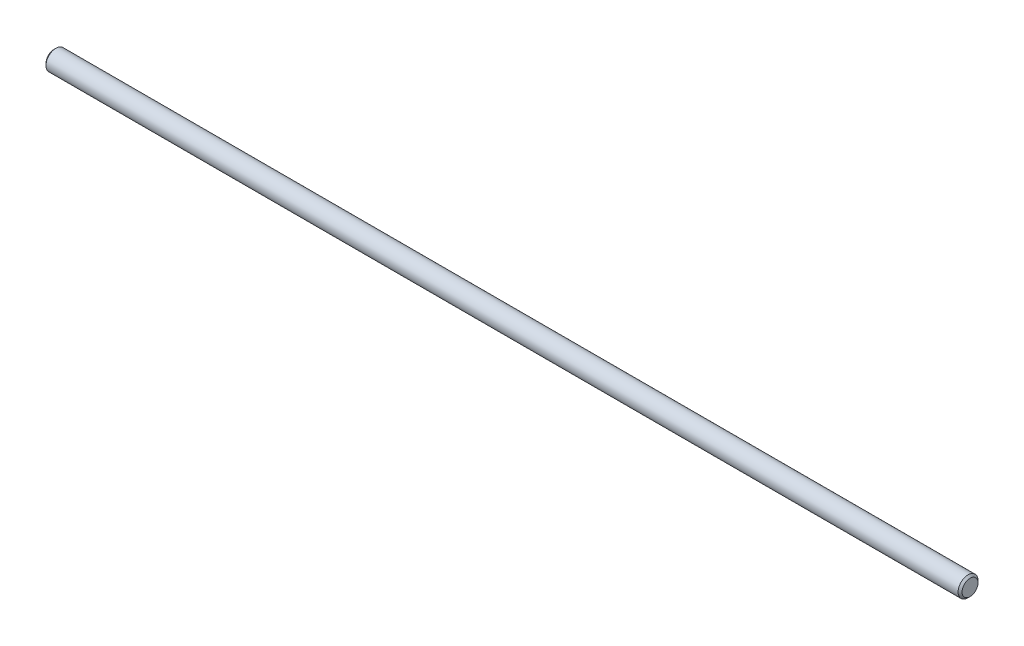
ISO-10303-21;
HEADER;
FILE_DESCRIPTION(('STEP AP214'),'2;1');
FILE_NAME('part.step','',(''),(''),'','','');
FILE_SCHEMA(('AUTOMOTIVE_DESIGN { 1 0 10303 214 1 1 1 1 }'));
ENDSEC;
DATA;
#1=APPLICATION_CONTEXT('core data for automotive mechanical design processes');
#2=APPLICATION_PROTOCOL_DEFINITION('international standard','automotive_design',2000,#1);
#3=PRODUCT_CONTEXT('',#1,'mechanical');
#4=PRODUCT('Part','Part','',(#3));
#5=PRODUCT_RELATED_PRODUCT_CATEGORY('part','',(#4));
#6=PRODUCT_DEFINITION_FORMATION('','',#4);
#7=PRODUCT_DEFINITION_CONTEXT('part definition',#1,'design');
#8=PRODUCT_DEFINITION('design','',#6,#7);
#9=PRODUCT_DEFINITION_SHAPE('','',#8);
#10=(LENGTH_UNIT() NAMED_UNIT(*) SI_UNIT(.MILLI.,.METRE.));
#11=(NAMED_UNIT(*) PLANE_ANGLE_UNIT() SI_UNIT($,.RADIAN.));
#12=(NAMED_UNIT(*) SI_UNIT($,.STERADIAN.) SOLID_ANGLE_UNIT());
#13=UNCERTAINTY_MEASURE_WITH_UNIT(LENGTH_MEASURE(1.E-05),#10,'distance_accuracy_value','');
#14=(GEOMETRIC_REPRESENTATION_CONTEXT(3) GLOBAL_UNCERTAINTY_ASSIGNED_CONTEXT((#13)) GLOBAL_UNIT_ASSIGNED_CONTEXT((#10,
#11,#12)) REPRESENTATION_CONTEXT('',''));
#15=CARTESIAN_POINT('',(0.,0.,0.));
#16=DIRECTION('',(0.,0.,1.));
#17=DIRECTION('',(1.,0.,0.));
#18=AXIS2_PLACEMENT_3D('',#15,#16,#17);
#19=CARTESIAN_POINT('',(230.,0.,0.));
#20=DIRECTION('',(-1.,0.,0.));
#21=DIRECTION('',(0.,0.,1.));
#22=AXIS2_PLACEMENT_3D('',#19,#20,#21);
#23=CYLINDRICAL_SURFACE('',#22,5.);
#24=CARTESIAN_POINT('',(229.,0.,0.));
#25=DIRECTION('',(1.,0.,0.));
#26=DIRECTION('',(0.,0.,-1.));
#27=AXIS2_PLACEMENT_3D('',#24,#25,#26);
#28=CIRCLE('',#27,5.);
#29=CARTESIAN_POINT('',(229.,0.,-5.));
#30=VERTEX_POINT('',#29);
#31=EDGE_CURVE('E38',#30,#30,#28,.F.);
#32=ORIENTED_EDGE('',*,*,#31,.T.);
#33=EDGE_LOOP('',(#32));
#34=FACE_BOUND('',#33,.T.);
#35=CARTESIAN_POINT('',(-229.,0.,0.));
#36=DIRECTION('',(1.,0.,0.));
#37=DIRECTION('',(0.,0.,-1.));
#38=AXIS2_PLACEMENT_3D('',#35,#36,#37);
#39=CIRCLE('',#38,5.);
#40=CARTESIAN_POINT('',(-229.,0.,-5.));
#41=VERTEX_POINT('',#40);
#42=EDGE_CURVE('E42',#41,#41,#39,.T.);
#43=ORIENTED_EDGE('',*,*,#42,.T.);
#44=EDGE_LOOP('',(#43));
#45=FACE_BOUND('',#44,.T.);
#46=ADVANCED_FACE('F31',(#34,#45),#23,.T.);
#47=CARTESIAN_POINT('',(230.,0.,0.));
#48=DIRECTION('',(1.,0.,0.));
#49=DIRECTION('',(0.,0.,-1.));
#50=AXIS2_PLACEMENT_3D('',#47,#48,#49);
#51=PLANE('',#50);
#52=CARTESIAN_POINT('',(230.,0.,0.));
#53=DIRECTION('',(1.,0.,0.));
#54=DIRECTION('',(0.,0.,-1.));
#55=AXIS2_PLACEMENT_3D('',#52,#53,#54);
#56=CIRCLE('',#55,3.99999999999989);
#57=CARTESIAN_POINT('',(230.,0.,-3.99999999999989));
#58=VERTEX_POINT('',#57);
#59=EDGE_CURVE('E46',#58,#58,#56,.T.);
#60=ORIENTED_EDGE('',*,*,#59,.T.);
#61=EDGE_LOOP('',(#60));
#62=FACE_BOUND('',#61,.T.);
#63=ADVANCED_FACE('F52',(#62),#51,.T.);
#64=CARTESIAN_POINT('',(-230.,0.,0.));
#65=DIRECTION('',(1.,0.,0.));
#66=DIRECTION('',(0.,0.,-1.));
#67=AXIS2_PLACEMENT_3D('',#64,#65,#66);
#68=PLANE('',#67);
#69=CARTESIAN_POINT('',(-230.,0.,0.));
#70=DIRECTION('',(1.,0.,0.));
#71=DIRECTION('',(0.,0.,-1.));
#72=AXIS2_PLACEMENT_3D('',#69,#70,#71);
#73=CIRCLE('',#72,4.00000000000006);
#74=CARTESIAN_POINT('',(-230.,0.,-4.00000000000006));
#75=VERTEX_POINT('',#74);
#76=EDGE_CURVE('E10',#75,#75,#73,.F.);
#77=ORIENTED_EDGE('',*,*,#76,.T.);
#78=EDGE_LOOP('',(#77));
#79=FACE_BOUND('',#78,.T.);
#80=ADVANCED_FACE('F56',(#79),#68,.F.);
#81=CARTESIAN_POINT('',(230.,0.,0.));
#82=DIRECTION('',(-1.,0.,0.));
#83=DIRECTION('',(0.,0.,1.));
#84=AXIS2_PLACEMENT_3D('',#81,#82,#83);
#85=CONICAL_SURFACE('',#84,3.99999999999989,0.785398163397473);
#86=ORIENTED_EDGE('',*,*,#31,.F.);
#87=EDGE_LOOP('',(#86));
#88=FACE_BOUND('',#87,.T.);
#89=ORIENTED_EDGE('',*,*,#59,.F.);
#90=EDGE_LOOP('',(#89));
#91=FACE_BOUND('',#90,.T.);
#92=ADVANCED_FACE('F54',(#88,#91),#85,.T.);
#93=CARTESIAN_POINT('',(-229.,0.,0.));
#94=DIRECTION('',(1.,0.,0.));
#95=DIRECTION('',(0.,0.,-1.));
#96=AXIS2_PLACEMENT_3D('',#93,#94,#95);
#97=CONICAL_SURFACE('',#96,5.,0.785398163397446);
#98=ORIENTED_EDGE('',*,*,#76,.F.);
#99=EDGE_LOOP('',(#98));
#100=FACE_BOUND('',#99,.T.);
#101=ORIENTED_EDGE('',*,*,#42,.F.);
#102=EDGE_LOOP('',(#101));
#103=FACE_BOUND('',#102,.T.);
#104=ADVANCED_FACE('F33',(#100,#103),#97,.T.);
#105=CLOSED_SHELL('',(#46,#63,#80,#92,#104));
#106=MANIFOLD_SOLID_BREP('B2',#105);
#107=ADVANCED_BREP_SHAPE_REPRESENTATION('',(#18,#106),#14);
#108=SHAPE_DEFINITION_REPRESENTATION(#9,#107);
ENDSEC;
END-ISO-10303-21;
